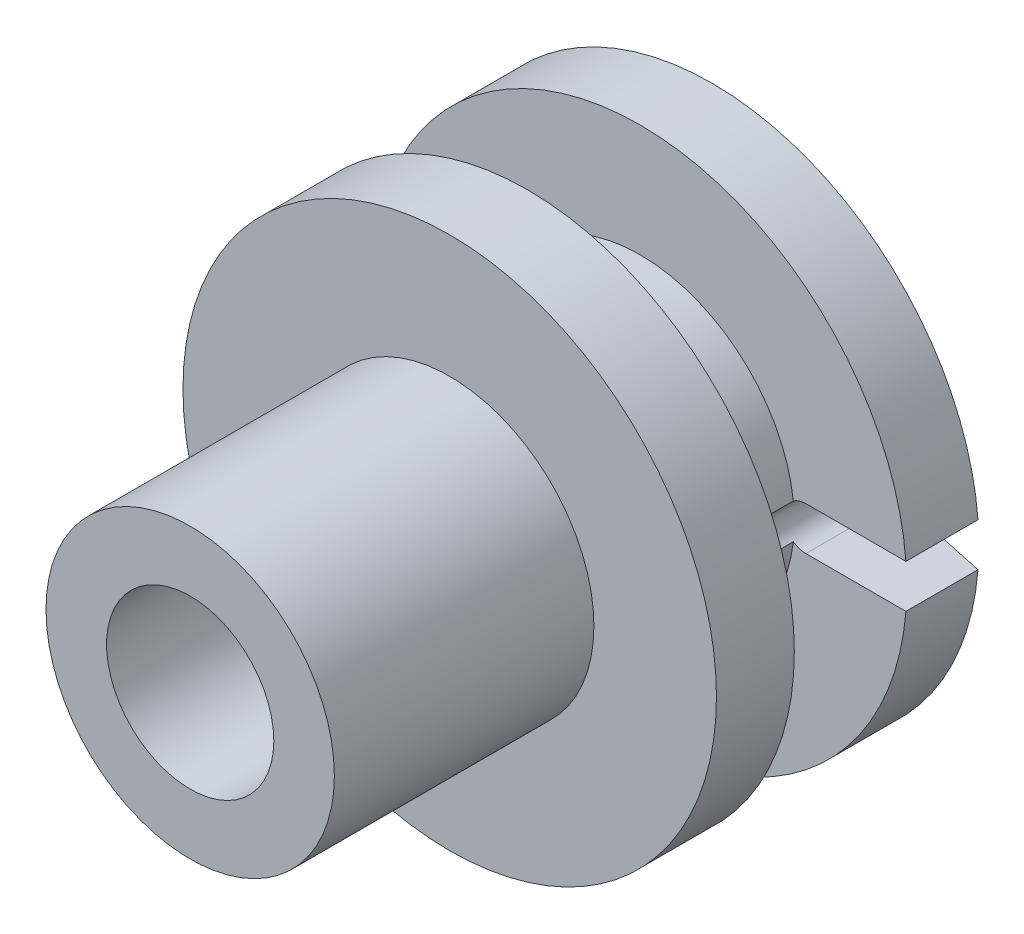
ISO-10303-21;
HEADER;
FILE_DESCRIPTION(('STEP AP214'),'2;1');
FILE_NAME('part.step','',(''),(''),'','','');
FILE_SCHEMA(('AUTOMOTIVE_DESIGN { 1 0 10303 214 1 1 1 1 }'));
ENDSEC;
DATA;
#1=APPLICATION_CONTEXT('core data for automotive mechanical design processes');
#2=APPLICATION_PROTOCOL_DEFINITION('international standard','automotive_design',2000,#1);
#3=PRODUCT_CONTEXT('',#1,'mechanical');
#4=PRODUCT('Part','Part','',(#3));
#5=PRODUCT_RELATED_PRODUCT_CATEGORY('part','',(#4));
#6=PRODUCT_DEFINITION_FORMATION('','',#4);
#7=PRODUCT_DEFINITION_CONTEXT('part definition',#1,'design');
#8=PRODUCT_DEFINITION('design','',#6,#7);
#9=PRODUCT_DEFINITION_SHAPE('','',#8);
#10=(LENGTH_UNIT() NAMED_UNIT(*) SI_UNIT(.MILLI.,.METRE.));
#11=(NAMED_UNIT(*) PLANE_ANGLE_UNIT() SI_UNIT($,.RADIAN.));
#12=(NAMED_UNIT(*) SI_UNIT($,.STERADIAN.) SOLID_ANGLE_UNIT());
#13=UNCERTAINTY_MEASURE_WITH_UNIT(LENGTH_MEASURE(1.E-05),#10,'distance_accuracy_value','');
#14=(GEOMETRIC_REPRESENTATION_CONTEXT(3) GLOBAL_UNCERTAINTY_ASSIGNED_CONTEXT((#13)) GLOBAL_UNIT_ASSIGNED_CONTEXT((#10,
#11,#12)) REPRESENTATION_CONTEXT('',''));
#15=CARTESIAN_POINT('',(0.,0.,0.));
#16=DIRECTION('',(0.,0.,1.));
#17=DIRECTION('',(1.,0.,0.));
#18=AXIS2_PLACEMENT_3D('',#15,#16,#17);
#19=CARTESIAN_POINT('',(0.,0.,2.5));
#20=DIRECTION('',(0.,0.,-1.));
#21=DIRECTION('',(-1.,0.,0.));
#22=AXIS2_PLACEMENT_3D('',#19,#20,#21);
#23=CYLINDRICAL_SURFACE('',#22,9.25);
#24=CARTESIAN_POINT('',(0.,0.,2.5));
#25=DIRECTION('',(0.,0.,1.));
#26=DIRECTION('',(1.,0.,0.));
#27=AXIS2_PLACEMENT_3D('',#24,#25,#26);
#28=CIRCLE('',#27,9.25);
#29=CARTESIAN_POINT('',(-9.21954445729289,-0.749999999999999,2.5));
#30=VERTEX_POINT('',#29);
#31=CARTESIAN_POINT('',(9.21954445729288,-0.75,2.5));
#32=VERTEX_POINT('',#31);
#33=EDGE_CURVE('E189',#30,#32,#28,.T.);
#34=ORIENTED_EDGE('',*,*,#33,.F.);
#35=DIRECTION('',(0.,0.,1.));
#36=VECTOR('',#35,1.);
#37=CARTESIAN_POINT('',(-9.21954445729289,-0.749999999999999,-4.5));
#38=LINE('',#37,#36);
#39=CARTESIAN_POINT('',(-9.21954445729289,-0.749999999999999,0.));
#40=VERTEX_POINT('',#39);
#41=EDGE_CURVE('E329',#40,#30,#38,.T.);
#42=ORIENTED_EDGE('',*,*,#41,.F.);
#43=CARTESIAN_POINT('',(0.,0.,0.));
#44=DIRECTION('',(0.,0.,1.));
#45=DIRECTION('',(1.,0.,0.));
#46=AXIS2_PLACEMENT_3D('',#43,#44,#45);
#47=CIRCLE('',#46,9.25);
#48=CARTESIAN_POINT('',(9.21954445729288,-0.75,0.));
#49=VERTEX_POINT('',#48);
#50=EDGE_CURVE('E161',#40,#49,#47,.T.);
#51=ORIENTED_EDGE('',*,*,#50,.T.);
#52=DIRECTION('',(0.,0.,1.));
#53=VECTOR('',#52,1.);
#54=CARTESIAN_POINT('',(9.21954445729288,-0.75,-4.5));
#55=LINE('',#54,#53);
#56=EDGE_CURVE('E332',#49,#32,#55,.T.);
#57=ORIENTED_EDGE('',*,*,#56,.T.);
#58=EDGE_LOOP('',(#34,#42,#51,#57));
#59=FACE_BOUND('',#58,.T.);
#60=ADVANCED_FACE('F42',(#59),#23,.T.);
#61=CARTESIAN_POINT('',(0.,0.,2.5));
#62=DIRECTION('',(0.,0.,1.));
#63=DIRECTION('',(1.,0.,0.));
#64=AXIS2_PLACEMENT_3D('',#61,#62,#63);
#65=PLANE('',#64);
#66=CARTESIAN_POINT('',(-5.75,0.,2.5));
#67=DIRECTION('',(0.,0.,1.));
#68=DIRECTION('',(1.,0.,0.));
#69=AXIS2_PLACEMENT_3D('',#66,#67,#68);
#70=CIRCLE('',#69,0.75);
#71=CARTESIAN_POINT('',(-5.75,-0.75,2.5));
#72=VERTEX_POINT('',#71);
#73=CARTESIAN_POINT('',(-5.315,-0.61096235563249,2.5));
#74=VERTEX_POINT('',#73);
#75=EDGE_CURVE('E303',#72,#74,#70,.T.);
#76=ORIENTED_EDGE('',*,*,#75,.F.);
#77=DIRECTION('',(1.,0.,0.));
#78=VECTOR('',#77,1.);
#79=CARTESIAN_POINT('',(0.,-0.75,2.5));
#80=LINE('',#79,#78);
#81=EDGE_CURVE('E298',#30,#72,#80,.T.);
#82=ORIENTED_EDGE('',*,*,#81,.F.);
#83=ORIENTED_EDGE('',*,*,#33,.T.);
#84=DIRECTION('',(1.,0.,0.));
#85=VECTOR('',#84,1.);
#86=CARTESIAN_POINT('',(0.,-0.75,2.5));
#87=LINE('',#86,#85);
#88=CARTESIAN_POINT('',(5.75,-0.75,2.5));
#89=VERTEX_POINT('',#88);
#90=EDGE_CURVE('E289',#89,#32,#87,.T.);
#91=ORIENTED_EDGE('',*,*,#90,.F.);
#92=CARTESIAN_POINT('',(5.75,0.,2.5));
#93=DIRECTION('',(0.,0.,1.));
#94=DIRECTION('',(1.,0.,0.));
#95=AXIS2_PLACEMENT_3D('',#92,#93,#94);
#96=CIRCLE('',#95,0.75);
#97=CARTESIAN_POINT('',(5.315,-0.610962355632485,2.5));
#98=VERTEX_POINT('',#97);
#99=EDGE_CURVE('E284',#98,#89,#96,.T.);
#100=ORIENTED_EDGE('',*,*,#99,.F.);
#101=CARTESIAN_POINT('',(0.,0.,2.5));
#102=DIRECTION('',(0.,0.,1.));
#103=DIRECTION('',(1.,0.,0.));
#104=AXIS2_PLACEMENT_3D('',#101,#102,#103);
#105=CIRCLE('',#104,5.35);
#106=EDGE_CURVE('E193',#74,#98,#105,.T.);
#107=ORIENTED_EDGE('',*,*,#106,.F.);
#108=EDGE_LOOP('',(#76,#82,#83,#91,#100,#107));
#109=FACE_BOUND('',#108,.T.);
#110=ADVANCED_FACE('F393',(#109),#65,.T.);
#111=CARTESIAN_POINT('',(9.21954445729289,0.75,0.));
#112=VERTEX_POINT('',#111);
#113=CARTESIAN_POINT('',(-9.21954445729289,0.75,0.));
#114=VERTEX_POINT('',#113);
#115=EDGE_CURVE('E148',#112,#114,#47,.T.);
#116=ORIENTED_EDGE('',*,*,#115,.T.);
#117=DIRECTION('',(0.,0.,1.));
#118=VECTOR('',#117,1.);
#119=CARTESIAN_POINT('',(-9.21954445729289,0.75,-4.5));
#120=LINE('',#119,#118);
#121=CARTESIAN_POINT('',(-9.21954445729289,0.75,2.5));
#122=VERTEX_POINT('',#121);
#123=EDGE_CURVE('E66',#114,#122,#120,.T.);
#124=ORIENTED_EDGE('',*,*,#123,.T.);
#125=CARTESIAN_POINT('',(9.21954445729289,0.75,2.5));
#126=VERTEX_POINT('',#125);
#127=EDGE_CURVE('E150',#126,#122,#28,.T.);
#128=ORIENTED_EDGE('',*,*,#127,.F.);
#129=DIRECTION('',(0.,0.,1.));
#130=VECTOR('',#129,1.);
#131=CARTESIAN_POINT('',(9.21954445729289,0.75,-4.5));
#132=LINE('',#131,#130);
#133=EDGE_CURVE('E136',#112,#126,#132,.T.);
#134=ORIENTED_EDGE('',*,*,#133,.F.);
#135=EDGE_LOOP('',(#116,#124,#128,#134));
#136=FACE_BOUND('',#135,.T.);
#137=ADVANCED_FACE('F44',(#136),#23,.T.);
#138=CARTESIAN_POINT('',(-5.315,0.610962355632488,2.5));
#139=VERTEX_POINT('',#138);
#140=CARTESIAN_POINT('',(-5.75,0.75,2.5));
#141=VERTEX_POINT('',#140);
#142=EDGE_CURVE('E169',#139,#141,#70,.T.);
#143=ORIENTED_EDGE('',*,*,#142,.F.);
#144=CARTESIAN_POINT('',(5.315,0.610962355632487,2.5));
#145=VERTEX_POINT('',#144);
#146=EDGE_CURVE('E177',#145,#139,#105,.T.);
#147=ORIENTED_EDGE('',*,*,#146,.F.);
#148=CARTESIAN_POINT('',(5.75,0.75,2.5));
#149=VERTEX_POINT('',#148);
#150=EDGE_CURVE('E285',#149,#145,#96,.T.);
#151=ORIENTED_EDGE('',*,*,#150,.F.);
#152=DIRECTION('',(-1.,0.,0.));
#153=VECTOR('',#152,1.);
#154=CARTESIAN_POINT('',(0.,0.75,2.5));
#155=LINE('',#154,#153);
#156=EDGE_CURVE('E323',#126,#149,#155,.T.);
#157=ORIENTED_EDGE('',*,*,#156,.F.);
#158=ORIENTED_EDGE('',*,*,#127,.T.);
#159=DIRECTION('',(-1.,0.,0.));
#160=VECTOR('',#159,1.);
#161=CARTESIAN_POINT('',(0.,0.75,2.5));
#162=LINE('',#161,#160);
#163=EDGE_CURVE('E295',#141,#122,#162,.T.);
#164=ORIENTED_EDGE('',*,*,#163,.F.);
#165=EDGE_LOOP('',(#143,#147,#151,#157,#158,#164));
#166=FACE_BOUND('',#165,.T.);
#167=ADVANCED_FACE('F321',(#166),#65,.T.);
#168=CARTESIAN_POINT('',(0.,0.,6.4));
#169=DIRECTION('',(0.,0.,-1.));
#170=DIRECTION('',(-1.,0.,0.));
#171=AXIS2_PLACEMENT_3D('',#168,#169,#170);
#172=CYLINDRICAL_SURFACE('',#171,5.35);
#173=ORIENTED_EDGE('',*,*,#146,.T.);
#174=DIRECTION('',(0.,0.,1.));
#175=VECTOR('',#174,1.);
#176=CARTESIAN_POINT('',(-5.315,0.610962355632487,0.));
#177=LINE('',#176,#175);
#178=CARTESIAN_POINT('',(-5.315,0.610962355632489,4.5));
#179=VERTEX_POINT('',#178);
#180=EDGE_CURVE('E171',#139,#179,#177,.T.);
#181=ORIENTED_EDGE('',*,*,#180,.T.);
#182=CARTESIAN_POINT('',(0.,0.,4.5));
#183=DIRECTION('',(0.,0.,1.));
#184=DIRECTION('',(1.,0.,0.));
#185=AXIS2_PLACEMENT_3D('',#182,#183,#184);
#186=CIRCLE('',#185,5.35);
#187=CARTESIAN_POINT('',(-5.315,-0.610962355632489,4.5));
#188=VERTEX_POINT('',#187);
#189=EDGE_CURVE('E11',#179,#188,#186,.T.);
#190=ORIENTED_EDGE('',*,*,#189,.T.);
#191=DIRECTION('',(0.,0.,1.));
#192=VECTOR('',#191,1.);
#193=CARTESIAN_POINT('',(-5.315,-0.610962355632487,0.));
#194=LINE('',#193,#192);
#195=EDGE_CURVE('E301',#188,#74,#194,.F.);
#196=ORIENTED_EDGE('',*,*,#195,.T.);
#197=ORIENTED_EDGE('',*,*,#106,.T.);
#198=DIRECTION('',(0.,0.,1.));
#199=VECTOR('',#198,1.);
#200=CARTESIAN_POINT('',(5.315,-0.610962355632487,0.));
#201=LINE('',#200,#199);
#202=CARTESIAN_POINT('',(5.315,-0.610962355632489,4.5));
#203=VERTEX_POINT('',#202);
#204=EDGE_CURVE('E272',#98,#203,#201,.T.);
#205=ORIENTED_EDGE('',*,*,#204,.T.);
#206=CARTESIAN_POINT('',(0.,0.,4.5));
#207=DIRECTION('',(0.,0.,-1.));
#208=DIRECTION('',(-1.,0.,0.));
#209=AXIS2_PLACEMENT_3D('',#206,#207,#208);
#210=CIRCLE('',#209,5.35);
#211=CARTESIAN_POINT('',(5.315,0.610962355632489,4.5));
#212=VERTEX_POINT('',#211);
#213=EDGE_CURVE('E51',#212,#203,#210,.T.);
#214=ORIENTED_EDGE('',*,*,#213,.F.);
#215=DIRECTION('',(0.,0.,1.));
#216=VECTOR('',#215,1.);
#217=CARTESIAN_POINT('',(5.315,0.610962355632487,0.));
#218=LINE('',#217,#216);
#219=EDGE_CURVE('E274',#212,#145,#218,.F.);
#220=ORIENTED_EDGE('',*,*,#219,.T.);
#221=EDGE_LOOP('',(#173,#181,#190,#196,#197,#205,#214,#220));
#222=FACE_BOUND('',#221,.T.);
#223=CARTESIAN_POINT('',(0.,0.,6.4));
#224=DIRECTION('',(0.,0.,1.));
#225=DIRECTION('',(1.,0.,0.));
#226=AXIS2_PLACEMENT_3D('',#223,#224,#225);
#227=CIRCLE('',#226,5.35);
#228=CARTESIAN_POINT('',(5.35,0.,6.4));
#229=VERTEX_POINT('',#228);
#230=EDGE_CURVE('E182',#229,#229,#227,.T.);
#231=ORIENTED_EDGE('',*,*,#230,.F.);
#232=EDGE_LOOP('',(#231));
#233=FACE_BOUND('',#232,.T.);
#234=ADVANCED_FACE('F279',(#222,#233),#172,.T.);
#235=CARTESIAN_POINT('',(0.,0.,9.1));
#236=DIRECTION('',(0.,0.,-1.));
#237=DIRECTION('',(-1.,0.,0.));
#238=AXIS2_PLACEMENT_3D('',#235,#236,#237);
#239=CYLINDRICAL_SURFACE('',#238,9.25);
#240=CARTESIAN_POINT('',(0.,0.,9.1));
#241=DIRECTION('',(0.,0.,1.));
#242=DIRECTION('',(1.,0.,0.));
#243=AXIS2_PLACEMENT_3D('',#240,#241,#242);
#244=CIRCLE('',#243,9.25);
#245=CARTESIAN_POINT('',(-9.25,0.,9.1));
#246=VERTEX_POINT('',#245);
#247=EDGE_CURVE('E178',#246,#246,#244,.T.);
#248=CARTESIAN_POINT('',(0.,0.,6.4));
#249=DIRECTION('',(0.,0.,1.));
#250=DIRECTION('',(1.,0.,0.));
#251=AXIS2_PLACEMENT_3D('',#248,#249,#250);
#252=CIRCLE('',#251,9.25);
#253=CARTESIAN_POINT('',(-9.25,0.,6.4));
#254=VERTEX_POINT('',#253);
#255=EDGE_CURVE('E166',#254,#254,#252,.T.);
#256=CARTESIAN_POINT('',(-9.25,0.,9.1));
#257=CARTESIAN_POINT('',(-9.25,0.,9.071875));
#258=CARTESIAN_POINT('',(-9.25,0.,9.04375));
#259=CARTESIAN_POINT('',(-9.25,0.,8.9875));
#260=CARTESIAN_POINT('',(-9.25,0.,8.959375));
#261=CARTESIAN_POINT('',(-9.25,0.,8.903125));
#262=CARTESIAN_POINT('',(-9.25,0.,8.875));
#263=CARTESIAN_POINT('',(-9.25,0.,8.81875));
#264=CARTESIAN_POINT('',(-9.25,0.,8.790625));
#265=CARTESIAN_POINT('',(-9.25,0.,8.734375));
#266=CARTESIAN_POINT('',(-9.25,0.,8.70625));
#267=CARTESIAN_POINT('',(-9.25,0.,8.65));
#268=CARTESIAN_POINT('',(-9.25,0.,8.621875));
#269=CARTESIAN_POINT('',(-9.25,0.,8.565625));
#270=CARTESIAN_POINT('',(-9.25,0.,8.5375));
#271=CARTESIAN_POINT('',(-9.25,0.,8.48125));
#272=CARTESIAN_POINT('',(-9.25,0.,8.453125));
#273=CARTESIAN_POINT('',(-9.25,0.,8.396875));
#274=CARTESIAN_POINT('',(-9.25,0.,8.36875));
#275=CARTESIAN_POINT('',(-9.25,0.,8.3125));
#276=CARTESIAN_POINT('',(-9.25,0.,8.284375));
#277=CARTESIAN_POINT('',(-9.25,0.,8.228125));
#278=CARTESIAN_POINT('',(-9.25,0.,8.2));
#279=CARTESIAN_POINT('',(-9.25,0.,8.14375));
#280=CARTESIAN_POINT('',(-9.25,0.,8.115625));
#281=CARTESIAN_POINT('',(-9.25,0.,8.059375));
#282=CARTESIAN_POINT('',(-9.25,0.,8.03125));
#283=CARTESIAN_POINT('',(-9.25,0.,7.975));
#284=CARTESIAN_POINT('',(-9.25,0.,7.946875));
#285=CARTESIAN_POINT('',(-9.25,0.,7.890625));
#286=CARTESIAN_POINT('',(-9.25,0.,7.8625));
#287=CARTESIAN_POINT('',(-9.25,0.,7.80625));
#288=CARTESIAN_POINT('',(-9.25,0.,7.778125));
#289=CARTESIAN_POINT('',(-9.25,0.,7.721875));
#290=CARTESIAN_POINT('',(-9.25,0.,7.69375));
#291=CARTESIAN_POINT('',(-9.25,0.,7.6375));
#292=CARTESIAN_POINT('',(-9.25,0.,7.609375));
#293=CARTESIAN_POINT('',(-9.25,0.,7.553125));
#294=CARTESIAN_POINT('',(-9.25,0.,7.525));
#295=CARTESIAN_POINT('',(-9.25,0.,7.46875));
#296=CARTESIAN_POINT('',(-9.25,0.,7.440625));
#297=CARTESIAN_POINT('',(-9.25,0.,7.384375));
#298=CARTESIAN_POINT('',(-9.25,0.,7.35625));
#299=CARTESIAN_POINT('',(-9.25,0.,7.3));
#300=CARTESIAN_POINT('',(-9.25,0.,7.271875));
#301=CARTESIAN_POINT('',(-9.25,0.,7.215625));
#302=CARTESIAN_POINT('',(-9.25,0.,7.1875));
#303=CARTESIAN_POINT('',(-9.25,0.,7.13125));
#304=CARTESIAN_POINT('',(-9.25,0.,7.103125));
#305=CARTESIAN_POINT('',(-9.25,0.,7.046875));
#306=CARTESIAN_POINT('',(-9.25,0.,7.01875));
#307=CARTESIAN_POINT('',(-9.25,0.,6.9625));
#308=CARTESIAN_POINT('',(-9.25,0.,6.934375));
#309=CARTESIAN_POINT('',(-9.25,0.,6.878125));
#310=CARTESIAN_POINT('',(-9.25,0.,6.85));
#311=CARTESIAN_POINT('',(-9.25,0.,6.79375));
#312=CARTESIAN_POINT('',(-9.25,0.,6.765625));
#313=CARTESIAN_POINT('',(-9.25,0.,6.709375));
#314=CARTESIAN_POINT('',(-9.25,0.,6.68125));
#315=CARTESIAN_POINT('',(-9.25,0.,6.625));
#316=CARTESIAN_POINT('',(-9.25,0.,6.596875));
#317=CARTESIAN_POINT('',(-9.25,0.,6.540625));
#318=CARTESIAN_POINT('',(-9.25,0.,6.5125));
#319=CARTESIAN_POINT('',(-9.25,0.,6.45625));
#320=CARTESIAN_POINT('',(-9.25,0.,6.428125));
#321=CARTESIAN_POINT('',(-9.25,0.,6.4));
#322=B_SPLINE_CURVE_WITH_KNOTS('',3,(#256,#257,#258,#259,#260,#261,#262,#263,#264,#265,#266,
#267,#268,#269,#270,#271,#272,#273,#274,#275,#276,#277,#278,#279,#280,#281,#282,#283,#284,#285,
#286,#287,#288,#289,#290,#291,#292,#293,#294,#295,#296,#297,#298,#299,#300,#301,#302,#303,#304,
#305,#306,#307,#308,#309,#310,#311,#312,#313,#314,#315,#316,#317,#318,#319,#320,#321),
.UNSPECIFIED.,.F.,.F.,(4,2,2,2,2,2,2,2,2,2,2,2,2,2,2,2,2,2,2,2,2,2,2,2,2,2,2,2,2,2,2,2,4),(0.,
0.0843750000000011,0.168750000000001,0.253125000000002,0.337500000000001,0.421875,
0.506250000000002,0.590625000000001,0.675,0.759375000000001,0.843750000000001,0.928125000000002,
1.0125,1.096875,1.18125,1.265625,1.35,1.434375,1.51875,1.603125,1.6875,1.771875,1.85625,
1.940625,2.025,2.109375,2.19375,2.278125,2.3625,2.446875,2.53125,2.615625,2.7),.UNSPECIFIED.);
#323=EDGE_CURVE('BSEAM378',#246,#254,#322,.T.);
#324=ORIENTED_EDGE('',*,*,#247,.F.);
#325=ORIENTED_EDGE('',*,*,#255,.T.);
#326=ORIENTED_EDGE('',*,*,#323,.T.);
#327=ORIENTED_EDGE('',*,*,#323,.F.);
#328=EDGE_LOOP('',(#324,#326,#325,#327));
#329=FACE_BOUND('',#328,.T.);
#330=ADVANCED_FACE('F378',(#329),#239,.T.);
#331=CARTESIAN_POINT('',(0.,0.,9.1));
#332=DIRECTION('',(0.,0.,1.));
#333=DIRECTION('',(1.,0.,0.));
#334=AXIS2_PLACEMENT_3D('',#331,#332,#333);
#335=PLANE('',#334);
#336=CARTESIAN_POINT('',(0.,0.,9.1));
#337=DIRECTION('',(0.,0.,1.));
#338=DIRECTION('',(1.,0.,0.));
#339=AXIS2_PLACEMENT_3D('',#336,#337,#338);
#340=CIRCLE('',#339,5.);
#341=CARTESIAN_POINT('',(5.,0.,9.1));
#342=VERTEX_POINT('',#341);
#343=EDGE_CURVE('E143',#342,#342,#340,.T.);
#344=ORIENTED_EDGE('',*,*,#343,.F.);
#345=EDGE_LOOP('',(#344));
#346=FACE_BOUND('',#345,.T.);
#347=ORIENTED_EDGE('',*,*,#247,.T.);
#348=EDGE_LOOP('',(#347));
#349=FACE_BOUND('',#348,.T.);
#350=ADVANCED_FACE('F375',(#346,#349),#335,.T.);
#351=CARTESIAN_POINT('',(0.,0.,6.4));
#352=DIRECTION('',(0.,0.,1.));
#353=DIRECTION('',(1.,0.,0.));
#354=AXIS2_PLACEMENT_3D('',#351,#352,#353);
#355=PLANE('',#354);
#356=ORIENTED_EDGE('',*,*,#230,.T.);
#357=EDGE_LOOP('',(#356));
#358=FACE_BOUND('',#357,.T.);
#359=ORIENTED_EDGE('',*,*,#255,.F.);
#360=EDGE_LOOP('',(#359));
#361=FACE_BOUND('',#360,.T.);
#362=ADVANCED_FACE('F371',(#358,#361),#355,.F.);
#363=CARTESIAN_POINT('',(0.,0.,18.1));
#364=DIRECTION('',(0.,0.,-1.));
#365=DIRECTION('',(-1.,0.,0.));
#366=AXIS2_PLACEMENT_3D('',#363,#364,#365);
#367=CYLINDRICAL_SURFACE('',#366,5.);
#368=CARTESIAN_POINT('',(0.,0.,18.1));
#369=DIRECTION('',(0.,0.,1.));
#370=DIRECTION('',(1.,0.,0.));
#371=AXIS2_PLACEMENT_3D('',#368,#369,#370);
#372=CIRCLE('',#371,5.);
#373=CARTESIAN_POINT('',(5.,0.,18.1));
#374=VERTEX_POINT('',#373);
#375=EDGE_CURVE('E160',#374,#374,#372,.T.);
#376=ORIENTED_EDGE('',*,*,#375,.F.);
#377=EDGE_LOOP('',(#376));
#378=FACE_BOUND('',#377,.T.);
#379=ORIENTED_EDGE('',*,*,#343,.T.);
#380=EDGE_LOOP('',(#379));
#381=FACE_BOUND('',#380,.T.);
#382=ADVANCED_FACE('F366',(#378,#381),#367,.T.);
#383=CARTESIAN_POINT('',(0.,0.,18.1));
#384=DIRECTION('',(0.,0.,1.));
#385=DIRECTION('',(1.,0.,0.));
#386=AXIS2_PLACEMENT_3D('',#383,#384,#385);
#387=PLANE('',#386);
#388=CARTESIAN_POINT('',(0.,0.,18.1));
#389=DIRECTION('',(0.,0.,1.));
#390=DIRECTION('',(1.,0.,0.));
#391=AXIS2_PLACEMENT_3D('',#388,#389,#390);
#392=CIRCLE('',#391,2.9);
#393=CARTESIAN_POINT('',(2.9,0.,18.1));
#394=VERTEX_POINT('',#393);
#395=EDGE_CURVE('E349',#394,#394,#392,.T.);
#396=ORIENTED_EDGE('',*,*,#395,.F.);
#397=EDGE_LOOP('',(#396));
#398=FACE_BOUND('',#397,.T.);
#399=ORIENTED_EDGE('',*,*,#375,.T.);
#400=EDGE_LOOP('',(#399));
#401=FACE_BOUND('',#400,.T.);
#402=ADVANCED_FACE('F363',(#398,#401),#387,.T.);
#403=CARTESIAN_POINT('',(0.,0.,0.));
#404=DIRECTION('',(0.,0.,1.));
#405=DIRECTION('',(1.,0.,0.));
#406=AXIS2_PLACEMENT_3D('',#403,#404,#405);
#407=CONICAL_SURFACE('',#406,9.25,1.3578579772155);
#408=CARTESIAN_POINT('',(-1.74508543574804,-0.75,-1.58931306686735));
#409=CARTESIAN_POINT('',(-1.82360150226372,-0.75,-1.57371113068621));
#410=CARTESIAN_POINT('',(-1.90208797024833,-0.75,-1.55796145809774));
#411=CARTESIAN_POINT('',(-2.05901425413357,-0.75,-1.52623253740182));
#412=CARTESIAN_POINT('',(-2.13745407018624,-0.75,-1.51025329004674));
#413=CARTESIAN_POINT('',(-2.37272184871856,-0.75,-1.46207013823869));
#414=CARTESIAN_POINT('',(-2.52949942315888,-0.75,-1.42962056714542));
#415=CARTESIAN_POINT('',(-2.84297277447175,-0.75,-1.36433752147866));
#416=CARTESIAN_POINT('',(-2.99966855213307,-0.75,-1.33150405068132));
#417=CARTESIAN_POINT('',(-3.31300840922828,-0.75,-1.26558939047493));
#418=CARTESIAN_POINT('',(-3.46965248852042,-0.75,-1.23250820039244));
#419=CARTESIAN_POINT('',(-3.93952187885024,-0.75,-1.13302312633199));
#420=CARTESIAN_POINT('',(-4.25269552047033,-0.75,-1.06637539604059));
#421=CARTESIAN_POINT('',(-4.87897240515267,-0.75,-0.932749889716133));
#422=CARTESIAN_POINT('',(-5.19207564818304,-0.75,-0.865772113533865));
#423=CARTESIAN_POINT('',(-6.13132453067913,-0.75,-0.664555982479223));
#424=CARTESIAN_POINT('',(-6.75740955817732,-0.75,-0.530034775130081));
#425=CARTESIAN_POINT('',(-8.00952049032291,-0.75,-0.26068559695424));
#426=CARTESIAN_POINT('',(-8.63554639427083,-0.75,-0.125857622880765));
#427=CARTESIAN_POINT('',(-9.88756226282309,-0.75,0.143964510858593));
#428=CARTESIAN_POINT('',(-10.5135522274348,-0.75,0.278958670490374));
#429=CARTESIAN_POINT('',(-11.4870261590726,-0.75,0.488964661623418));
#430=CARTESIAN_POINT('',(-11.8345172119658,-0.75,0.563943661420241));
#431=CARTESIAN_POINT('',(-12.5294924760938,-0.75,0.713924593990994));
#432=CARTESIAN_POINT('',(-12.8769766873549,-0.75,0.788926526643547));
#433=CARTESIAN_POINT('',(-13.2244590215449,-0.75,0.863937158616341));
#434=B_SPLINE_CURVE_WITH_KNOTS('',3,(#408,#409,#410,#411,#412,#413,#414,#415,#416,#417,#418,
#419,#420,#421,#422,#423,#424,#425,#426,#427,#428,#429,#430,#431,#432,#433),.UNSPECIFIED.,.F.,
.F.,(4,2,2,2,2,2,2,2,2,2,2,2,4),(0.,0.240153086498246,0.480305386134644,0.960606064206049,
1.44090202186111,1.92119928569965,2.88175955064345,3.8423202498583,5.7634409286202,
7.68458203571859,9.60572274864464,10.6721874414772,11.7386465842288),.UNSPECIFIED.);
#435=CARTESIAN_POINT('',(-5.75,-0.75,-0.746225567054789));
#436=VERTEX_POINT('',#435);
#437=EDGE_CURVE('E258',#436,#40,#434,.T.);
#438=ORIENTED_EDGE('',*,*,#437,.F.);
#439=CARTESIAN_POINT('',(-5.7502,0.749999973333333,-0.746182687770247));
#440=CARTESIAN_POINT('',(-5.70713790359556,0.750043281027715,-0.755410567575574));
#441=CARTESIAN_POINT('',(-5.66410616775927,0.746316158150977,-0.764742308514874));
#442=CARTESIAN_POINT('',(-5.57930256094259,0.731574543063641,-0.783339100818236));
#443=CARTESIAN_POINT('',(-5.53753044419014,0.720561482203698,-0.792604164919896));
#444=CARTESIAN_POINT('',(-5.45640504635775,0.691493303053032,-0.810802037929285));
#445=CARTESIAN_POINT('',(-5.41705310948015,0.673434311520649,-0.819734661126326));
#446=CARTESIAN_POINT('',(-5.34194280934931,0.630756223838908,-0.836967233114819));
#447=CARTESIAN_POINT('',(-5.30618336549421,0.606139108521716,-0.845267371971526));
#448=CARTESIAN_POINT('',(-5.23958154283184,0.551200728937295,-0.860877345422477));
#449=CARTESIAN_POINT('',(-5.20870323260918,0.520925111283647,-0.868194350810277));
#450=CARTESIAN_POINT('',(-5.15249461927136,0.455358488599956,-0.881623733330799));
#451=CARTESIAN_POINT('',(-5.12716449303791,0.420067323728323,-0.887736072056909));
#452=CARTESIAN_POINT('',(-5.08341821711652,0.346355592489381,-0.898359767951098));
#453=CARTESIAN_POINT('',(-5.06485324876156,0.308028331837966,-0.902905448110474));
#454=CARTESIAN_POINT('',(-5.03444134687073,0.228650688244352,-0.910382298717424));
#455=CARTESIAN_POINT('',(-5.02259282972792,0.187600949760591,-0.913313849740187));
#456=CARTESIAN_POINT('',(-5.00624482057127,0.105114954530545,-0.91736539584692));
#457=CARTESIAN_POINT('',(-5.00155848776718,0.0637179250219528,-0.918531440065925));
#458=CARTESIAN_POINT('',(-4.99909952814483,-0.0192925402038371,-0.919142789195577));
#459=CARTESIAN_POINT('',(-5.00132634721473,-0.0609059583098701,-0.918588232018081));
#460=CARTESIAN_POINT('',(-5.01253910589237,-0.142574789886506,-0.915804723378642));
#461=CARTESIAN_POINT('',(-5.0214330296307,-0.182643675312942,-0.91359856696407));
#462=CARTESIAN_POINT('',(-5.04557981797364,-0.260693466236257,-0.907640331983127));
#463=CARTESIAN_POINT('',(-5.06083282382667,-0.298674325332524,-0.903888219077875));
#464=CARTESIAN_POINT('',(-5.09736605048978,-0.371825377635181,-0.894965134059763));
#465=CARTESIAN_POINT('',(-5.11869451504595,-0.406970060927391,-0.889782815730025));
#466=CARTESIAN_POINT('',(-5.16667674207528,-0.473187321038366,-0.87822545851944));
#467=CARTESIAN_POINT('',(-5.19333081902819,-0.504259657203747,-0.871850349205179));
#468=CARTESIAN_POINT('',(-5.25189293257638,-0.562252419284509,-0.857980831924496));
#469=CARTESIAN_POINT('',(-5.28391133280045,-0.589055838705194,-0.85046331034371));
#470=CARTESIAN_POINT('',(-5.3518300099177,-0.636936401815532,-0.834689376426977));
#471=CARTESIAN_POINT('',(-5.38773203467131,-0.658010952060487,-0.826432631687475));
#472=CARTESIAN_POINT('',(-5.4634124109895,-0.694389764657167,-0.809222298459619));
#473=CARTESIAN_POINT('',(-5.50326794915319,-0.70952744108911,-0.800256084547682));
#474=CARTESIAN_POINT('',(-5.58486747620909,-0.732820500467392,-0.78211095710686));
#475=CARTESIAN_POINT('',(-5.6266087063883,-0.740985756473252,-0.772932363304008));
#476=CARTESIAN_POINT('',(-5.69578065526613,-0.748536687598484,-0.757890206098595));
#477=CARTESIAN_POINT('',(-5.72299285380536,-0.750017442504321,-0.75201454619012));
#478=CARTESIAN_POINT('',(-5.7502,-0.749999973333335,-0.746182687770248));
#479=B_SPLINE_CURVE_WITH_KNOTS('',3,(#439,#440,#441,#442,#443,#444,#445,#446,#447,#448,#449,
#450,#451,#452,#453,#454,#455,#456,#457,#458,#459,#460,#461,#462,#463,#464,#465,#466,#467,#468,
#469,#470,#471,#472,#473,#474,#475,#476,#477,#478),.UNSPECIFIED.,.F.,.F.,(4,2,2,2,2,2,2,2,2,2,2,
2,2,2,2,2,2,2,2,4),(0.,0.131949002371338,0.263872090546058,0.395867801002546,0.527823688256312,
0.658757765342921,0.789696016132796,0.917549694454059,1.04537321484338,1.16980157085525,
1.29421995378302,1.416952085643,1.53968694378369,1.66342496038602,1.7871702859327,
1.91387371767198,2.04063441257661,2.17073352556114,2.30064810916398,2.38412042104965),.UNSPECIFIED.);
#480=CARTESIAN_POINT('',(-5.75,0.75,-0.746225567054789));
#481=VERTEX_POINT('',#480);
#482=EDGE_CURVE('E241',#481,#436,#479,.T.);
#483=ORIENTED_EDGE('',*,*,#482,.F.);
#484=CARTESIAN_POINT('',(-13.2244590215448,0.75,0.863937158616341));
#485=CARTESIAN_POINT('',(-12.7463628955108,0.75,0.760732405729348));
#486=CARTESIAN_POINT('',(-12.2682636672295,0.75,0.657542016296908));
#487=CARTESIAN_POINT('',(-11.3120550963319,0.75,0.451210389190146));
#488=CARTESIAN_POINT('',(-10.833945753726,0.75,0.34806915146766));
#489=CARTESIAN_POINT('',(-9.87771369878987,0.75,0.141856393477938));
#490=CARTESIAN_POINT('',(-9.39959098650952,0.75,0.0387848729795124));
#491=CARTESIAN_POINT('',(-8.44332163293426,0.75,-0.167249336208559));
#492=CARTESIAN_POINT('',(-7.96517499161684,0.75,-0.270212024793707));
#493=CARTESIAN_POINT('',(-7.0088401287887,0.75,-0.475959277783332));
#494=CARTESIAN_POINT('',(-6.53065190702918,0.75,-0.578743841032135));
#495=CARTESIAN_POINT('',(-5.81331539822096,0.75,-0.732665000425383));
#496=CARTESIAN_POINT('',(-5.57419453195899,0.75,-0.783929368168751));
#497=CARTESIAN_POINT('',(-5.09592565217671,0.75,-0.886332476769073));
#498=CARTESIAN_POINT('',(-4.85677763863095,0.75,-0.937471217507273));
#499=CARTESIAN_POINT('',(-4.37843864239585,0.75,-1.03955805585071));
#500=CARTESIAN_POINT('',(-4.13924765933569,0.75,-1.09050615171884));
#501=CARTESIAN_POINT('',(-3.6608010044411,0.75,-1.19209510988528));
#502=CARTESIAN_POINT('',(-3.42154533278042,0.75,-1.24273597300047));
#503=CARTESIAN_POINT('',(-3.06257256805052,0.75,-1.31828049238834));
#504=CARTESIAN_POINT('',(-2.94289939557483,0.75,-1.34339268358764));
#505=CARTESIAN_POINT('',(-2.70351141193355,0.75,-1.3934168329312));
#506=CARTESIAN_POINT('',(-2.58379660083837,0.75,-1.41832879141241));
#507=CARTESIAN_POINT('',(-2.34430706924805,0.75,-1.46787002234602));
#508=CARTESIAN_POINT('',(-2.22453234817843,0.75,-1.49249929203126));
#509=CARTESIAN_POINT('',(-1.98488837836544,0.75,-1.54129667754949));
#510=CARTESIAN_POINT('',(-1.8650191290624,0.75,-1.56546479063043));
#511=CARTESIAN_POINT('',(-1.74508543574804,0.75,-1.58931306686735));
#512=B_SPLINE_CURVE_WITH_KNOTS('',3,(#484,#485,#486,#487,#488,#489,#490,#491,#492,#493,#494,
#495,#496,#497,#498,#499,#500,#501,#502,#503,#504,#505,#506,#507,#508,#509,#510,#511),
.UNSPECIFIED.,.F.,.F.,(4,2,2,2,2,2,2,2,2,2,2,2,2,4),(0.,1.46732550810304,2.93464957541864,
4.40196875285188,5.86928933791472,7.33661940755436,8.0702824010354,8.80394608777008,
9.53761644327614,10.2712848472666,10.6381233883445,11.0049613120067,11.3718028234865,
11.7386465234754),.UNSPECIFIED.);
#513=EDGE_CURVE('E158',#114,#481,#512,.T.);
#514=ORIENTED_EDGE('',*,*,#513,.F.);
#515=ORIENTED_EDGE('',*,*,#115,.F.);
#516=CARTESIAN_POINT('',(1.74508543574804,0.75,-1.58931306686735));
#517=CARTESIAN_POINT('',(1.82360150226372,0.75,-1.57371113068621));
#518=CARTESIAN_POINT('',(1.90208797024833,0.75,-1.55796145809774));
#519=CARTESIAN_POINT('',(2.05901425413358,0.75,-1.52623253740182));
#520=CARTESIAN_POINT('',(2.13745407018624,0.75,-1.51025329004674));
#521=CARTESIAN_POINT('',(2.37272184871856,0.75,-1.46207013823869));
#522=CARTESIAN_POINT('',(2.52949942315888,0.75,-1.42962056714542));
#523=CARTESIAN_POINT('',(2.84297277447175,0.75,-1.36433752147866));
#524=CARTESIAN_POINT('',(2.99966855213307,0.75,-1.33150405068132));
#525=CARTESIAN_POINT('',(3.31300840922828,0.75,-1.26558939047493));
#526=CARTESIAN_POINT('',(3.46965248852042,0.75,-1.23250820039244));
#527=CARTESIAN_POINT('',(3.93952187885024,0.75,-1.13302312633199));
#528=CARTESIAN_POINT('',(4.25269552047033,0.75,-1.06637539604059));
#529=CARTESIAN_POINT('',(4.87897240515267,0.75,-0.932749889716133));
#530=CARTESIAN_POINT('',(5.19207564818304,0.75,-0.865772113533865));
#531=CARTESIAN_POINT('',(6.13132453067913,0.75,-0.664555982479223));
#532=CARTESIAN_POINT('',(6.75740955817732,0.75,-0.530034775130081));
#533=CARTESIAN_POINT('',(8.00952049032291,0.75,-0.26068559695424));
#534=CARTESIAN_POINT('',(8.63554639427083,0.75,-0.125857622880765));
#535=CARTESIAN_POINT('',(9.88756226282309,0.75,0.143964510858593));
#536=CARTESIAN_POINT('',(10.5135522274348,0.75,0.278958670490374));
#537=CARTESIAN_POINT('',(11.4870261590726,0.75,0.488964661623418));
#538=CARTESIAN_POINT('',(11.8345172119658,0.75,0.563943661420241));
#539=CARTESIAN_POINT('',(12.5294924760938,0.75,0.713924593990994));
#540=CARTESIAN_POINT('',(12.8769766873549,0.75,0.788926526643547));
#541=CARTESIAN_POINT('',(13.2244590215449,0.75,0.863937158616341));
#542=B_SPLINE_CURVE_WITH_KNOTS('',3,(#516,#517,#518,#519,#520,#521,#522,#523,#524,#525,#526,
#527,#528,#529,#530,#531,#532,#533,#534,#535,#536,#537,#538,#539,#540,#541),.UNSPECIFIED.,.F.,
.F.,(4,2,2,2,2,2,2,2,2,2,2,2,4),(0.,0.240153086498247,0.480305386134645,0.960606064206049,
1.44090202186111,1.92119928569965,2.88175955064345,3.8423202498583,5.76344092862019,
7.68458203571859,9.60572274864464,10.6721874414772,11.7386465842288),.UNSPECIFIED.);
#543=CARTESIAN_POINT('',(5.75,0.75,-0.746225567054789));
#544=VERTEX_POINT('',#543);
#545=EDGE_CURVE('E133',#544,#112,#542,.T.);
#546=ORIENTED_EDGE('',*,*,#545,.F.);
#547=CARTESIAN_POINT('',(5.7502,-0.749999973333333,-0.746182687770247));
#548=CARTESIAN_POINT('',(5.70713790359556,-0.750043281027715,-0.755410567575574));
#549=CARTESIAN_POINT('',(5.66410616775927,-0.746316158150977,-0.764742308514874));
#550=CARTESIAN_POINT('',(5.57930256094259,-0.731574543063641,-0.783339100818236));
#551=CARTESIAN_POINT('',(5.53753044419014,-0.720561482203698,-0.792604164919896));
#552=CARTESIAN_POINT('',(5.45640504635775,-0.691493303053032,-0.810802037929285));
#553=CARTESIAN_POINT('',(5.41705310948015,-0.673434311520649,-0.819734661126326));
#554=CARTESIAN_POINT('',(5.34194280934931,-0.630756223838908,-0.836967233114819));
#555=CARTESIAN_POINT('',(5.30618336549421,-0.606139108521716,-0.845267371971526));
#556=CARTESIAN_POINT('',(5.23958154283184,-0.551200728937295,-0.860877345422477));
#557=CARTESIAN_POINT('',(5.20870323260918,-0.520925111283647,-0.868194350810277));
#558=CARTESIAN_POINT('',(5.15249461927136,-0.455358488599956,-0.881623733330799));
#559=CARTESIAN_POINT('',(5.12716449303791,-0.420067323728323,-0.887736072056909));
#560=CARTESIAN_POINT('',(5.08341821711652,-0.346355592489381,-0.898359767951098));
#561=CARTESIAN_POINT('',(5.06485324876156,-0.308028331837966,-0.902905448110474));
#562=CARTESIAN_POINT('',(5.03444134687073,-0.228650688244352,-0.910382298717424));
#563=CARTESIAN_POINT('',(5.02259282972792,-0.187600949760591,-0.913313849740187));
#564=CARTESIAN_POINT('',(5.00624482057127,-0.105114954530545,-0.91736539584692));
#565=CARTESIAN_POINT('',(5.00155848776718,-0.0637179250219528,-0.918531440065925));
#566=CARTESIAN_POINT('',(4.99909952814483,0.0192925402038371,-0.919142789195577));
#567=CARTESIAN_POINT('',(5.00132634721473,0.0609059583098701,-0.918588232018081));
#568=CARTESIAN_POINT('',(5.01253910589237,0.142574789886506,-0.915804723378642));
#569=CARTESIAN_POINT('',(5.0214330296307,0.182643675312942,-0.91359856696407));
#570=CARTESIAN_POINT('',(5.04557981797364,0.260693466236257,-0.907640331983127));
#571=CARTESIAN_POINT('',(5.06083282382667,0.298674325332524,-0.903888219077875));
#572=CARTESIAN_POINT('',(5.09736605048978,0.371825377635181,-0.894965134059763));
#573=CARTESIAN_POINT('',(5.11869451504595,0.406970060927391,-0.889782815730025));
#574=CARTESIAN_POINT('',(5.16667674207528,0.473187321038366,-0.87822545851944));
#575=CARTESIAN_POINT('',(5.19333081902819,0.504259657203747,-0.871850349205179));
#576=CARTESIAN_POINT('',(5.25189293257638,0.562252419284509,-0.857980831924496));
#577=CARTESIAN_POINT('',(5.28391133280045,0.589055838705194,-0.85046331034371));
#578=CARTESIAN_POINT('',(5.3518300099177,0.636936401815532,-0.834689376426977));
#579=CARTESIAN_POINT('',(5.38773203467131,0.658010952060487,-0.826432631687475));
#580=CARTESIAN_POINT('',(5.4634124109895,0.694389764657167,-0.809222298459619));
#581=CARTESIAN_POINT('',(5.50326794915319,0.70952744108911,-0.800256084547682));
#582=CARTESIAN_POINT('',(5.58486747620909,0.732820500467392,-0.78211095710686));
#583=CARTESIAN_POINT('',(5.6266087063883,0.740985756473252,-0.772932363304008));
#584=CARTESIAN_POINT('',(5.69578065526613,0.748536687598484,-0.757890206098595));
#585=CARTESIAN_POINT('',(5.72299285380536,0.750017442504321,-0.75201454619012));
#586=CARTESIAN_POINT('',(5.7502,0.749999973333335,-0.746182687770248));
#587=B_SPLINE_CURVE_WITH_KNOTS('',3,(#547,#548,#549,#550,#551,#552,#553,#554,#555,#556,#557,
#558,#559,#560,#561,#562,#563,#564,#565,#566,#567,#568,#569,#570,#571,#572,#573,#574,#575,#576,
#577,#578,#579,#580,#581,#582,#583,#584,#585,#586),.UNSPECIFIED.,.F.,.F.,(4,2,2,2,2,2,2,2,2,2,2,
2,2,2,2,2,2,2,2,4),(0.,0.131949002371338,0.263872090546058,0.395867801002546,0.527823688256312,
0.658757765342921,0.789696016132796,0.917549694454059,1.04537321484338,1.16980157085525,
1.29421995378302,1.416952085643,1.53968694378369,1.66342496038602,1.7871702859327,
1.91387371767198,2.04063441257661,2.17073352556114,2.30064810916398,2.38412042104965),.UNSPECIFIED.);
#588=CARTESIAN_POINT('',(5.75,-0.75,-0.746225567054789));
#589=VERTEX_POINT('',#588);
#590=EDGE_CURVE('E142',#589,#544,#587,.T.);
#591=ORIENTED_EDGE('',*,*,#590,.F.);
#592=CARTESIAN_POINT('',(13.2244590215448,-0.75,0.86393715861634));
#593=CARTESIAN_POINT('',(12.7463628955108,-0.75,0.760732405729347));
#594=CARTESIAN_POINT('',(12.2682636672295,-0.75,0.657542016296908));
#595=CARTESIAN_POINT('',(11.3120550963319,-0.75,0.451210389190145));
#596=CARTESIAN_POINT('',(10.833945753726,-0.75,0.348069151467659));
#597=CARTESIAN_POINT('',(9.87771369878987,-0.75,0.141856393477937));
#598=CARTESIAN_POINT('',(9.39959098650951,-0.75,0.0387848729795119));
#599=CARTESIAN_POINT('',(8.44332163293426,-0.75,-0.16724933620856));
#600=CARTESIAN_POINT('',(7.96517499161684,-0.75,-0.270212024793707));
#601=CARTESIAN_POINT('',(7.0088401287887,-0.75,-0.475959277783332));
#602=CARTESIAN_POINT('',(6.53065190702918,-0.75,-0.578743841032135));
#603=CARTESIAN_POINT('',(5.81331539822096,-0.75,-0.732665000425382));
#604=CARTESIAN_POINT('',(5.574194531959,-0.75,-0.783929368168751));
#605=CARTESIAN_POINT('',(5.09592565217671,-0.75,-0.886332476769072));
#606=CARTESIAN_POINT('',(4.85677763863095,-0.75,-0.937471217507273));
#607=CARTESIAN_POINT('',(4.37843864239585,-0.75,-1.03955805585071));
#608=CARTESIAN_POINT('',(4.1392476593357,-0.75,-1.09050615171884));
#609=CARTESIAN_POINT('',(3.6608010044411,-0.75,-1.19209510988528));
#610=CARTESIAN_POINT('',(3.42154533278043,-0.75,-1.24273597300047));
#611=CARTESIAN_POINT('',(3.06257256805052,-0.75,-1.31828049238834));
#612=CARTESIAN_POINT('',(2.94289939557483,-0.75,-1.34339268358764));
#613=CARTESIAN_POINT('',(2.70351141193355,-0.75,-1.3934168329312));
#614=CARTESIAN_POINT('',(2.58379660083837,-0.75,-1.41832879141241));
#615=CARTESIAN_POINT('',(2.34430706924806,-0.75,-1.46787002234602));
#616=CARTESIAN_POINT('',(2.22453234817843,-0.75,-1.49249929203126));
#617=CARTESIAN_POINT('',(1.98488837836544,-0.75,-1.54129667754949));
#618=CARTESIAN_POINT('',(1.8650191290624,-0.75,-1.56546479063043));
#619=CARTESIAN_POINT('',(1.74508543574804,-0.75,-1.58931306686735));
#620=B_SPLINE_CURVE_WITH_KNOTS('',3,(#592,#593,#594,#595,#596,#597,#598,#599,#600,#601,#602,
#603,#604,#605,#606,#607,#608,#609,#610,#611,#612,#613,#614,#615,#616,#617,#618,#619),
.UNSPECIFIED.,.F.,.F.,(4,2,2,2,2,2,2,2,2,2,2,2,2,4),(0.,1.46732550810304,2.93464957541864,
4.40196875285188,5.86928933791472,7.33661940755436,8.0702824010354,8.80394608777008,
9.53761644327614,10.2712848472666,10.6381233883445,11.0049613120067,11.3718028234865,
11.7386465234754),.UNSPECIFIED.);
#621=EDGE_CURVE('E228',#49,#589,#620,.T.);
#622=ORIENTED_EDGE('',*,*,#621,.F.);
#623=ORIENTED_EDGE('',*,*,#50,.F.);
#624=EDGE_LOOP('',(#438,#483,#514,#515,#546,#591,#622,#623));
#625=FACE_BOUND('',#624,.T.);
#626=CARTESIAN_POINT('',(0.,0.,-2.));
#627=VERTEX_POINT('',#626);
#628=VERTEX_LOOP('',#627);
#629=FACE_BOUND('',#628,.T.);
#630=ADVANCED_FACE('F155',(#625,#629),#407,.T.);
#631=CARTESIAN_POINT('',(0.,0.,4.5));
#632=DIRECTION('',(0.,0.,-1.));
#633=DIRECTION('',(-1.,0.,0.));
#634=AXIS2_PLACEMENT_3D('',#631,#632,#633);
#635=PLANE('',#634);
#636=ORIENTED_EDGE('',*,*,#213,.T.);
#637=CARTESIAN_POINT('',(5.75,0.,4.5));
#638=DIRECTION('',(0.,0.,1.));
#639=DIRECTION('',(-1.,0.,0.));
#640=AXIS2_PLACEMENT_3D('',#637,#638,#639);
#641=CIRCLE('',#640,0.75);
#642=EDGE_CURVE('E152',#212,#203,#641,.T.);
#643=ORIENTED_EDGE('',*,*,#642,.F.);
#644=EDGE_LOOP('',(#636,#643));
#645=FACE_BOUND('',#644,.T.);
#646=ADVANCED_FACE('F226',(#645),#635,.T.);
#647=CARTESIAN_POINT('',(5.75,-0.75,-4.5));
#648=DIRECTION('',(0.,-1.,0.));
#649=DIRECTION('',(1.,0.,0.));
#650=AXIS2_PLACEMENT_3D('',#647,#648,#649);
#651=PLANE('',#650);
#652=ORIENTED_EDGE('',*,*,#90,.T.);
#653=ORIENTED_EDGE('',*,*,#56,.F.);
#654=ORIENTED_EDGE('',*,*,#621,.T.);
#655=DIRECTION('',(0.,0.,1.));
#656=VECTOR('',#655,1.);
#657=CARTESIAN_POINT('',(5.75,-0.75,-4.5));
#658=LINE('',#657,#656);
#659=EDGE_CURVE('E336',#589,#89,#658,.T.);
#660=ORIENTED_EDGE('',*,*,#659,.T.);
#661=EDGE_LOOP('',(#652,#653,#654,#660));
#662=FACE_BOUND('',#661,.T.);
#663=ADVANCED_FACE('F222',(#662),#651,.F.);
#664=CARTESIAN_POINT('',(5.75,0.,-4.5));
#665=DIRECTION('',(0.,0.,1.));
#666=DIRECTION('',(1.,0.,0.));
#667=AXIS2_PLACEMENT_3D('',#664,#665,#666);
#668=CYLINDRICAL_SURFACE('',#667,0.75);
#669=ORIENTED_EDGE('',*,*,#99,.T.);
#670=ORIENTED_EDGE('',*,*,#659,.F.);
#671=ORIENTED_EDGE('',*,*,#590,.T.);
#672=DIRECTION('',(0.,0.,1.));
#673=VECTOR('',#672,1.);
#674=CARTESIAN_POINT('',(5.75,0.75,-4.5));
#675=LINE('',#674,#673);
#676=EDGE_CURVE('E58',#544,#149,#675,.T.);
#677=ORIENTED_EDGE('',*,*,#676,.T.);
#678=ORIENTED_EDGE('',*,*,#150,.T.);
#679=ORIENTED_EDGE('',*,*,#219,.F.);
#680=ORIENTED_EDGE('',*,*,#642,.T.);
#681=ORIENTED_EDGE('',*,*,#204,.F.);
#682=EDGE_LOOP('',(#669,#670,#671,#677,#678,#679,#680,#681));
#683=FACE_BOUND('',#682,.T.);
#684=ADVANCED_FACE('F215',(#683),#668,.F.);
#685=CARTESIAN_POINT('',(5.75,0.75,-4.5));
#686=DIRECTION('',(0.,1.,0.));
#687=DIRECTION('',(0.,0.,1.));
#688=AXIS2_PLACEMENT_3D('',#685,#686,#687);
#689=PLANE('',#688);
#690=ORIENTED_EDGE('',*,*,#156,.T.);
#691=ORIENTED_EDGE('',*,*,#676,.F.);
#692=ORIENTED_EDGE('',*,*,#545,.T.);
#693=ORIENTED_EDGE('',*,*,#133,.T.);
#694=EDGE_LOOP('',(#690,#691,#692,#693));
#695=FACE_BOUND('',#694,.T.);
#696=ADVANCED_FACE('F135',(#695),#689,.F.);
#697=CARTESIAN_POINT('',(-5.75,0.,4.5));
#698=DIRECTION('',(0.,0.,1.));
#699=DIRECTION('',(1.,0.,0.));
#700=AXIS2_PLACEMENT_3D('',#697,#698,#699);
#701=PLANE('',#700);
#702=CARTESIAN_POINT('',(-5.75,0.,4.5));
#703=DIRECTION('',(0.,0.,1.));
#704=DIRECTION('',(1.,0.,0.));
#705=AXIS2_PLACEMENT_3D('',#702,#703,#704);
#706=CIRCLE('',#705,0.75);
#707=EDGE_CURVE('E276',#188,#179,#706,.T.);
#708=ORIENTED_EDGE('',*,*,#707,.F.);
#709=ORIENTED_EDGE('',*,*,#189,.F.);
#710=EDGE_LOOP('',(#708,#709));
#711=FACE_BOUND('',#710,.T.);
#712=ADVANCED_FACE('F214',(#711),#701,.F.);
#713=CARTESIAN_POINT('',(-5.75,0.,-4.5));
#714=DIRECTION('',(0.,0.,1.));
#715=DIRECTION('',(1.,0.,0.));
#716=AXIS2_PLACEMENT_3D('',#713,#714,#715);
#717=CYLINDRICAL_SURFACE('',#716,0.75);
#718=ORIENTED_EDGE('',*,*,#142,.T.);
#719=DIRECTION('',(0.,0.,1.));
#720=VECTOR('',#719,1.);
#721=CARTESIAN_POINT('',(-5.75,0.75,-4.5));
#722=LINE('',#721,#720);
#723=EDGE_CURVE('E314',#481,#141,#722,.T.);
#724=ORIENTED_EDGE('',*,*,#723,.F.);
#725=ORIENTED_EDGE('',*,*,#482,.T.);
#726=DIRECTION('',(0.,0.,1.));
#727=VECTOR('',#726,1.);
#728=CARTESIAN_POINT('',(-5.75,-0.75,-4.5));
#729=LINE('',#728,#727);
#730=EDGE_CURVE('E325',#436,#72,#729,.T.);
#731=ORIENTED_EDGE('',*,*,#730,.T.);
#732=ORIENTED_EDGE('',*,*,#75,.T.);
#733=ORIENTED_EDGE('',*,*,#195,.F.);
#734=ORIENTED_EDGE('',*,*,#707,.T.);
#735=ORIENTED_EDGE('',*,*,#180,.F.);
#736=EDGE_LOOP('',(#718,#724,#725,#731,#732,#733,#734,#735));
#737=FACE_BOUND('',#736,.T.);
#738=ADVANCED_FACE('F216',(#737),#717,.F.);
#739=CARTESIAN_POINT('',(-5.75,-0.75,-4.5));
#740=DIRECTION('',(0.,-1.,0.));
#741=DIRECTION('',(1.,0.,0.));
#742=AXIS2_PLACEMENT_3D('',#739,#740,#741);
#743=PLANE('',#742);
#744=ORIENTED_EDGE('',*,*,#81,.T.);
#745=ORIENTED_EDGE('',*,*,#730,.F.);
#746=ORIENTED_EDGE('',*,*,#437,.T.);
#747=ORIENTED_EDGE('',*,*,#41,.T.);
#748=EDGE_LOOP('',(#744,#745,#746,#747));
#749=FACE_BOUND('',#748,.T.);
#750=ADVANCED_FACE('F252',(#749),#743,.F.);
#751=CARTESIAN_POINT('',(-5.75,0.75,-4.5));
#752=DIRECTION('',(0.,1.,0.));
#753=DIRECTION('',(0.,0.,1.));
#754=AXIS2_PLACEMENT_3D('',#751,#752,#753);
#755=PLANE('',#754);
#756=ORIENTED_EDGE('',*,*,#163,.T.);
#757=ORIENTED_EDGE('',*,*,#123,.F.);
#758=ORIENTED_EDGE('',*,*,#513,.T.);
#759=ORIENTED_EDGE('',*,*,#723,.T.);
#760=EDGE_LOOP('',(#756,#757,#758,#759));
#761=FACE_BOUND('',#760,.T.);
#762=ADVANCED_FACE('F247',(#761),#755,.F.);
#763=CARTESIAN_POINT('',(0.,0.,6.1));
#764=DIRECTION('',(0.,0.,1.));
#765=DIRECTION('',(1.,0.,0.));
#766=AXIS2_PLACEMENT_3D('',#763,#764,#765);
#767=CYLINDRICAL_SURFACE('',#766,2.9);
#768=CARTESIAN_POINT('',(0.,0.,6.1));
#769=DIRECTION('',(0.,0.,1.));
#770=DIRECTION('',(1.,0.,0.));
#771=AXIS2_PLACEMENT_3D('',#768,#769,#770);
#772=CIRCLE('',#771,2.9);
#773=CARTESIAN_POINT('',(2.9,0.,6.1));
#774=VERTEX_POINT('',#773);
#775=EDGE_CURVE('E337',#774,#774,#772,.T.);
#776=ORIENTED_EDGE('',*,*,#775,.F.);
#777=EDGE_LOOP('',(#776));
#778=FACE_BOUND('',#777,.T.);
#779=ORIENTED_EDGE('',*,*,#395,.T.);
#780=EDGE_LOOP('',(#779));
#781=FACE_BOUND('',#780,.T.);
#782=ADVANCED_FACE('F251',(#778,#781),#767,.F.);
#783=CARTESIAN_POINT('',(0.,0.,6.1));
#784=DIRECTION('',(0.,0.,1.));
#785=DIRECTION('',(1.,0.,0.));
#786=AXIS2_PLACEMENT_3D('',#783,#784,#785);
#787=PLANE('',#786);
#788=ORIENTED_EDGE('',*,*,#775,.T.);
#789=EDGE_LOOP('',(#788));
#790=FACE_BOUND('',#789,.T.);
#791=ADVANCED_FACE('F357',(#790),#787,.T.);
#792=CLOSED_SHELL('',(#60,#110,#137,#167,#234,#330,#350,#362,#382,#402,#630,#646,#663,#684,#696,
#712,#738,#750,#762,#782,#791));
#793=MANIFOLD_SOLID_BREP('B2',#792);
#794=ADVANCED_BREP_SHAPE_REPRESENTATION('',(#18,#793),#14);
#795=SHAPE_DEFINITION_REPRESENTATION(#9,#794);
ENDSEC;
END-ISO-10303-21;
